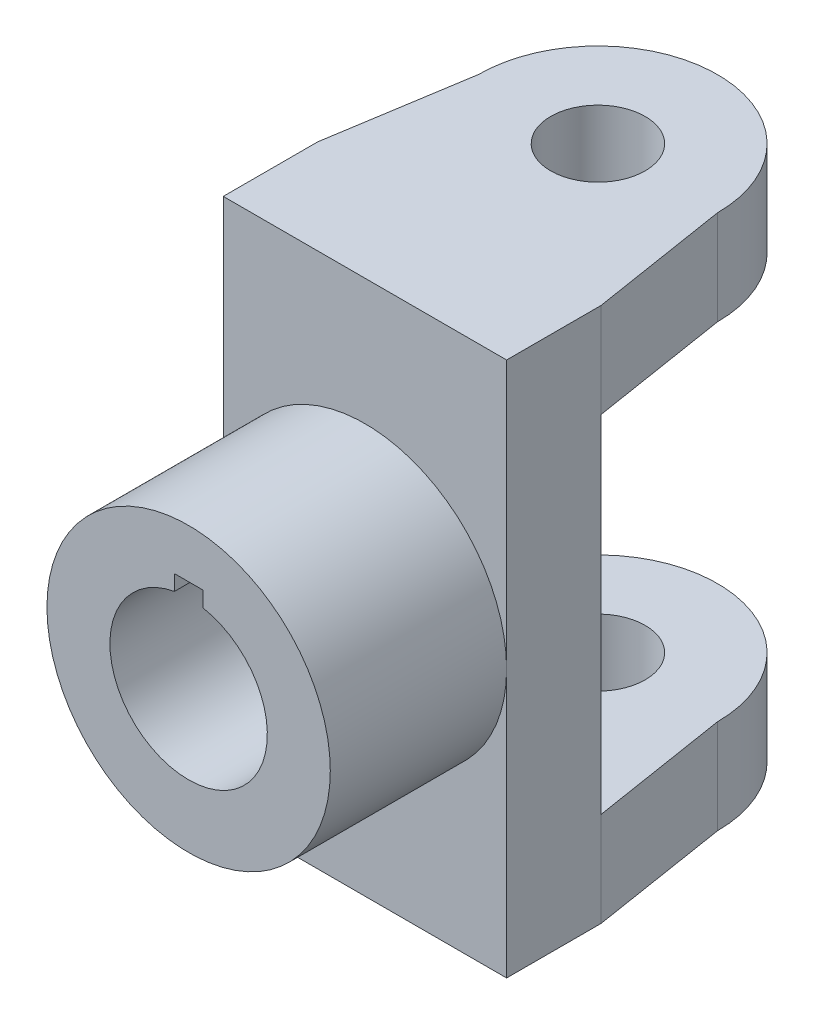
ISO-10303-21;
HEADER;
FILE_DESCRIPTION(('STEP AP214'),'2;1');
FILE_NAME('part.step','',(''),(''),'','','');
FILE_SCHEMA(('AUTOMOTIVE_DESIGN { 1 0 10303 214 1 1 1 1 }'));
ENDSEC;
DATA;
#1=APPLICATION_CONTEXT('core data for automotive mechanical design processes');
#2=APPLICATION_PROTOCOL_DEFINITION('international standard','automotive_design',2000,#1);
#3=PRODUCT_CONTEXT('',#1,'mechanical');
#4=PRODUCT('Part','Part','',(#3));
#5=PRODUCT_RELATED_PRODUCT_CATEGORY('part','',(#4));
#6=PRODUCT_DEFINITION_FORMATION('','',#4);
#7=PRODUCT_DEFINITION_CONTEXT('part definition',#1,'design');
#8=PRODUCT_DEFINITION('design','',#6,#7);
#9=PRODUCT_DEFINITION_SHAPE('','',#8);
#10=(LENGTH_UNIT() NAMED_UNIT(*) SI_UNIT(.MILLI.,.METRE.));
#11=(NAMED_UNIT(*) PLANE_ANGLE_UNIT() SI_UNIT($,.RADIAN.));
#12=(NAMED_UNIT(*) SI_UNIT($,.STERADIAN.) SOLID_ANGLE_UNIT());
#13=UNCERTAINTY_MEASURE_WITH_UNIT(LENGTH_MEASURE(1.E-05),#10,'distance_accuracy_value','');
#14=(GEOMETRIC_REPRESENTATION_CONTEXT(3) GLOBAL_UNCERTAINTY_ASSIGNED_CONTEXT((#13)) GLOBAL_UNIT_ASSIGNED_CONTEXT((#10,
#11,#12)) REPRESENTATION_CONTEXT('',''));
#15=CARTESIAN_POINT('',(0.,0.,0.));
#16=DIRECTION('',(0.,0.,1.));
#17=DIRECTION('',(1.,0.,0.));
#18=AXIS2_PLACEMENT_3D('',#15,#16,#17);
#19=CARTESIAN_POINT('',(57.233249370277,-85.,-9.10528967254403));
#20=DIRECTION('',(0.987580306335114,0.,-0.157115048735131));
#21=DIRECTION('',(-0.157115048735131,0.,-0.987580306335114));
#22=AXIS2_PLACEMENT_3D('',#19,#20,#21);
#23=PLANE('',#22);
#24=DIRECTION('',(0.157115048735131,0.,0.987580306335114));
#25=VECTOR('',#24,1.);
#26=CARTESIAN_POINT('',(57.233249370277,55.,-9.10528967254403));
#27=LINE('',#26,#25);
#28=CARTESIAN_POINT('',(38.,55.,-130.));
#29=VERTEX_POINT('',#28);
#30=CARTESIAN_POINT('',(44.9999999999999,55.,-86.));
#31=VERTEX_POINT('',#30);
#32=EDGE_CURVE('E278',#29,#31,#27,.T.);
#33=ORIENTED_EDGE('',*,*,#32,.F.);
#34=DIRECTION('',(0.,1.,0.));
#35=VECTOR('',#34,1.);
#36=CARTESIAN_POINT('',(38.,-85.,-130.));
#37=LINE('',#36,#35);
#38=CARTESIAN_POINT('',(38.,85.,-130.));
#39=VERTEX_POINT('',#38);
#40=EDGE_CURVE('E304',#29,#39,#37,.T.);
#41=ORIENTED_EDGE('',*,*,#40,.T.);
#42=DIRECTION('',(-0.157115048735131,0.,-0.987580306335114));
#43=VECTOR('',#42,1.);
#44=CARTESIAN_POINT('',(57.233249370277,85.,-9.10528967254403));
#45=LINE('',#44,#43);
#46=CARTESIAN_POINT('',(45.,85.,-86.));
#47=VERTEX_POINT('',#46);
#48=EDGE_CURVE('E281',#47,#39,#45,.T.);
#49=ORIENTED_EDGE('',*,*,#48,.F.);
#50=DIRECTION('',(0.,-1.,0.));
#51=VECTOR('',#50,1.);
#52=CARTESIAN_POINT('',(45.,85.,-86.));
#53=LINE('',#52,#51);
#54=EDGE_CURVE('E193',#47,#31,#53,.T.);
#55=ORIENTED_EDGE('',*,*,#54,.T.);
#56=EDGE_LOOP('',(#33,#41,#49,#55));
#57=FACE_BOUND('',#56,.T.);
#58=ADVANCED_FACE('F53',(#57),#23,.T.);
#59=CARTESIAN_POINT('',(-57.233249370277,-85.,-9.10528967254403));
#60=DIRECTION('',(0.987580306335114,0.,0.157115048735131));
#61=DIRECTION('',(0.157115048735131,0.,-0.987580306335114));
#62=AXIS2_PLACEMENT_3D('',#59,#60,#61);
#63=PLANE('',#62);
#64=DIRECTION('',(0.,1.,0.));
#65=VECTOR('',#64,1.);
#66=CARTESIAN_POINT('',(-38.,-85.,-130.));
#67=LINE('',#66,#65);
#68=CARTESIAN_POINT('',(-38.,55.,-130.));
#69=VERTEX_POINT('',#68);
#70=CARTESIAN_POINT('',(-38.,85.,-130.));
#71=VERTEX_POINT('',#70);
#72=EDGE_CURVE('E311',#69,#71,#67,.T.);
#73=ORIENTED_EDGE('',*,*,#72,.F.);
#74=DIRECTION('',(-0.157115048735131,0.,0.987580306335114));
#75=VECTOR('',#74,1.);
#76=CARTESIAN_POINT('',(-57.233249370277,55.,-9.10528967254403));
#77=LINE('',#76,#75);
#78=CARTESIAN_POINT('',(-45.,55.,-86.));
#79=VERTEX_POINT('',#78);
#80=EDGE_CURVE('E325',#69,#79,#77,.T.);
#81=ORIENTED_EDGE('',*,*,#80,.T.);
#82=DIRECTION('',(0.,1.,0.));
#83=VECTOR('',#82,1.);
#84=CARTESIAN_POINT('',(-45.,85.,-86.));
#85=LINE('',#84,#83);
#86=CARTESIAN_POINT('',(-45.,85.,-86.));
#87=VERTEX_POINT('',#86);
#88=EDGE_CURVE('E187',#79,#87,#85,.T.);
#89=ORIENTED_EDGE('',*,*,#88,.T.);
#90=DIRECTION('',(0.157115048735131,0.,-0.987580306335114));
#91=VECTOR('',#90,1.);
#92=CARTESIAN_POINT('',(-57.233249370277,85.,-9.10528967254403));
#93=LINE('',#92,#91);
#94=EDGE_CURVE('E298',#87,#71,#93,.T.);
#95=ORIENTED_EDGE('',*,*,#94,.T.);
#96=EDGE_LOOP('',(#73,#81,#89,#95));
#97=FACE_BOUND('',#96,.T.);
#98=ADVANCED_FACE('F324',(#97),#63,.F.);
#99=CARTESIAN_POINT('',(0.,-85.,-130.));
#100=DIRECTION('',(0.,1.,0.));
#101=DIRECTION('',(0.,0.,1.));
#102=AXIS2_PLACEMENT_3D('',#99,#100,#101);
#103=CYLINDRICAL_SURFACE('',#102,15.);
#104=CARTESIAN_POINT('',(0.,55.,-130.));
#105=DIRECTION('',(0.,1.,0.));
#106=DIRECTION('',(0.,0.,1.));
#107=AXIS2_PLACEMENT_3D('',#104,#105,#106);
#108=CIRCLE('',#107,15.);
#109=CARTESIAN_POINT('',(0.,55.,-115.));
#110=VERTEX_POINT('',#109);
#111=EDGE_CURVE('E286',#110,#110,#108,.F.);
#112=ORIENTED_EDGE('',*,*,#111,.T.);
#113=EDGE_LOOP('',(#112));
#114=FACE_BOUND('',#113,.T.);
#115=CARTESIAN_POINT('',(0.,85.,-130.));
#116=DIRECTION('',(0.,1.,0.));
#117=DIRECTION('',(0.,0.,1.));
#118=AXIS2_PLACEMENT_3D('',#115,#116,#117);
#119=CIRCLE('',#118,15.);
#120=CARTESIAN_POINT('',(0.,85.,-115.));
#121=VERTEX_POINT('',#120);
#122=EDGE_CURVE('E285',#121,#121,#119,.T.);
#123=ORIENTED_EDGE('',*,*,#122,.T.);
#124=EDGE_LOOP('',(#123));
#125=FACE_BOUND('',#124,.T.);
#126=ADVANCED_FACE('F339',(#114,#125),#103,.F.);
#127=CARTESIAN_POINT('',(0.,-85.,-130.));
#128=DIRECTION('',(0.,1.,0.));
#129=DIRECTION('',(0.,0.,1.));
#130=AXIS2_PLACEMENT_3D('',#127,#128,#129);
#131=CYLINDRICAL_SURFACE('',#130,38.);
#132=CARTESIAN_POINT('',(0.,55.,-130.));
#133=DIRECTION('',(0.,1.,0.));
#134=DIRECTION('',(0.,0.,1.));
#135=AXIS2_PLACEMENT_3D('',#132,#133,#134);
#136=CIRCLE('',#135,38.);
#137=EDGE_CURVE('E12',#69,#29,#136,.F.);
#138=ORIENTED_EDGE('',*,*,#137,.F.);
#139=ORIENTED_EDGE('',*,*,#72,.T.);
#140=CARTESIAN_POINT('',(0.,85.,-130.));
#141=DIRECTION('',(0.,1.,0.));
#142=DIRECTION('',(0.,0.,1.));
#143=AXIS2_PLACEMENT_3D('',#140,#141,#142);
#144=CIRCLE('',#143,38.);
#145=EDGE_CURVE('E307',#39,#71,#144,.T.);
#146=ORIENTED_EDGE('',*,*,#145,.F.);
#147=ORIENTED_EDGE('',*,*,#40,.F.);
#148=EDGE_LOOP('',(#138,#139,#146,#147));
#149=FACE_BOUND('',#148,.T.);
#150=ADVANCED_FACE('F318',(#149),#131,.T.);
#151=CARTESIAN_POINT('',(0.,0.,0.));
#152=DIRECTION('',(0.,0.,1.));
#153=DIRECTION('',(1.,0.,0.));
#154=AXIS2_PLACEMENT_3D('',#151,#152,#153);
#155=PLANE('',#154);
#156=CARTESIAN_POINT('',(0.,0.,0.));
#157=DIRECTION('',(0.,0.,1.));
#158=DIRECTION('',(1.,0.,0.));
#159=AXIS2_PLACEMENT_3D('',#156,#157,#158);
#160=CIRCLE('',#159,45.);
#161=CARTESIAN_POINT('',(45.,0.,0.));
#162=VERTEX_POINT('',#161);
#163=EDGE_CURVE('E249',#162,#162,#160,.T.);
#164=ORIENTED_EDGE('',*,*,#163,.T.);
#165=EDGE_LOOP('',(#164));
#166=FACE_BOUND('',#165,.T.);
#167=DIRECTION('',(0.,-1.,0.));
#168=VECTOR('',#167,1.);
#169=CARTESIAN_POINT('',(-4.5,29.4916652547159,0.));
#170=LINE('',#169,#168);
#171=CARTESIAN_POINT('',(-4.5,29.4916652547159,0.));
#172=VERTEX_POINT('',#171);
#173=CARTESIAN_POINT('',(-4.5,24.5916652547159,0.));
#174=VERTEX_POINT('',#173);
#175=EDGE_CURVE('E222',#172,#174,#170,.T.);
#176=ORIENTED_EDGE('',*,*,#175,.F.);
#177=DIRECTION('',(1.,0.,0.));
#178=VECTOR('',#177,1.);
#179=CARTESIAN_POINT('',(-4.5,29.4916652547159,0.));
#180=LINE('',#179,#178);
#181=CARTESIAN_POINT('',(4.5,29.4916652547159,0.));
#182=VERTEX_POINT('',#181);
#183=EDGE_CURVE('E217',#172,#182,#180,.T.);
#184=ORIENTED_EDGE('',*,*,#183,.T.);
#185=DIRECTION('',(0.,-1.,0.));
#186=VECTOR('',#185,1.);
#187=CARTESIAN_POINT('',(4.5,29.4916652547159,0.));
#188=LINE('',#187,#186);
#189=CARTESIAN_POINT('',(4.5,24.5916652547159,0.));
#190=VERTEX_POINT('',#189);
#191=EDGE_CURVE('E232',#182,#190,#188,.T.);
#192=ORIENTED_EDGE('',*,*,#191,.T.);
#193=CARTESIAN_POINT('',(0.,0.,0.));
#194=DIRECTION('',(0.,0.,1.));
#195=DIRECTION('',(1.,0.,0.));
#196=AXIS2_PLACEMENT_3D('',#193,#194,#195);
#197=CIRCLE('',#196,25.);
#198=EDGE_CURVE('E235',#174,#190,#197,.T.);
#199=ORIENTED_EDGE('',*,*,#198,.F.);
#200=EDGE_LOOP('',(#176,#184,#192,#199));
#201=FACE_BOUND('',#200,.T.);
#202=ADVANCED_FACE('F381',(#166,#201),#155,.T.);
#203=CARTESIAN_POINT('',(0.,0.,-56.));
#204=DIRECTION('',(0.,0.,1.));
#205=DIRECTION('',(1.,0.,0.));
#206=AXIS2_PLACEMENT_3D('',#203,#204,#205);
#207=CYLINDRICAL_SURFACE('',#206,45.);
#208=CARTESIAN_POINT('',(0.,0.,-56.));
#209=DIRECTION('',(0.,0.,1.));
#210=DIRECTION('',(1.,0.,0.));
#211=AXIS2_PLACEMENT_3D('',#208,#209,#210);
#212=CIRCLE('',#211,45.);
#213=CARTESIAN_POINT('',(45.,0.,-56.));
#214=VERTEX_POINT('',#213);
#215=CARTESIAN_POINT('',(-45.,0.,-56.));
#216=VERTEX_POINT('',#215);
#217=EDGE_CURVE('E250',#214,#216,#212,.T.);
#218=ORIENTED_EDGE('',*,*,#217,.T.);
#219=EDGE_CURVE('E253',#216,#214,#212,.T.);
#220=ORIENTED_EDGE('',*,*,#219,.T.);
#221=EDGE_LOOP('',(#218,#220));
#222=FACE_BOUND('',#221,.T.);
#223=ORIENTED_EDGE('',*,*,#163,.F.);
#224=EDGE_LOOP('',(#223));
#225=FACE_BOUND('',#224,.T.);
#226=ADVANCED_FACE('F55',(#222,#225),#207,.T.);
#227=CARTESIAN_POINT('',(-4.5,29.4916652547159,-56.));
#228=DIRECTION('',(0.,-1.,0.));
#229=DIRECTION('',(0.,0.,-1.));
#230=AXIS2_PLACEMENT_3D('',#227,#228,#229);
#231=PLANE('',#230);
#232=ORIENTED_EDGE('',*,*,#183,.F.);
#233=DIRECTION('',(0.,0.,1.));
#234=VECTOR('',#233,1.);
#235=CARTESIAN_POINT('',(-4.5,29.4916652547159,-56.));
#236=LINE('',#235,#234);
#237=CARTESIAN_POINT('',(-4.5,29.4916652547159,-56.));
#238=VERTEX_POINT('',#237);
#239=EDGE_CURVE('E229',#238,#172,#236,.T.);
#240=ORIENTED_EDGE('',*,*,#239,.F.);
#241=DIRECTION('',(1.,0.,0.));
#242=VECTOR('',#241,1.);
#243=CARTESIAN_POINT('',(-4.5,29.4916652547159,-56.));
#244=LINE('',#243,#242);
#245=CARTESIAN_POINT('',(4.5,29.4916652547159,-56.));
#246=VERTEX_POINT('',#245);
#247=EDGE_CURVE('E218',#238,#246,#244,.T.);
#248=ORIENTED_EDGE('',*,*,#247,.T.);
#249=DIRECTION('',(0.,0.,1.));
#250=VECTOR('',#249,1.);
#251=CARTESIAN_POINT('',(4.5,29.4916652547159,-56.));
#252=LINE('',#251,#250);
#253=EDGE_CURVE('E246',#246,#182,#252,.T.);
#254=ORIENTED_EDGE('',*,*,#253,.T.);
#255=EDGE_LOOP('',(#232,#240,#248,#254));
#256=FACE_BOUND('',#255,.T.);
#257=ADVANCED_FACE('F388',(#256),#231,.T.);
#258=CARTESIAN_POINT('',(4.5,29.4916652547159,-56.));
#259=DIRECTION('',(-1.,0.,0.));
#260=DIRECTION('',(0.,-1.,0.));
#261=AXIS2_PLACEMENT_3D('',#258,#259,#260);
#262=PLANE('',#261);
#263=ORIENTED_EDGE('',*,*,#191,.F.);
#264=ORIENTED_EDGE('',*,*,#253,.F.);
#265=DIRECTION('',(0.,-1.,0.));
#266=VECTOR('',#265,1.);
#267=CARTESIAN_POINT('',(4.5,29.4916652547159,-56.));
#268=LINE('',#267,#266);
#269=CARTESIAN_POINT('',(4.5,24.5916652547159,-56.));
#270=VERTEX_POINT('',#269);
#271=EDGE_CURVE('E221',#246,#270,#268,.T.);
#272=ORIENTED_EDGE('',*,*,#271,.T.);
#273=DIRECTION('',(0.,0.,1.));
#274=VECTOR('',#273,1.);
#275=CARTESIAN_POINT('',(4.5,24.5916652547159,-56.));
#276=LINE('',#275,#274);
#277=EDGE_CURVE('E244',#270,#190,#276,.T.);
#278=ORIENTED_EDGE('',*,*,#277,.T.);
#279=EDGE_LOOP('',(#263,#264,#272,#278));
#280=FACE_BOUND('',#279,.T.);
#281=ADVANCED_FACE('F393',(#280),#262,.T.);
#282=CARTESIAN_POINT('',(0.,0.,-56.));
#283=DIRECTION('',(0.,0.,1.));
#284=DIRECTION('',(1.,0.,0.));
#285=AXIS2_PLACEMENT_3D('',#282,#283,#284);
#286=CYLINDRICAL_SURFACE('',#285,25.);
#287=ORIENTED_EDGE('',*,*,#198,.T.);
#288=ORIENTED_EDGE('',*,*,#277,.F.);
#289=CARTESIAN_POINT('',(0.,0.,-56.));
#290=DIRECTION('',(0.,0.,1.));
#291=DIRECTION('',(1.,0.,0.));
#292=AXIS2_PLACEMENT_3D('',#289,#290,#291);
#293=CIRCLE('',#292,25.);
#294=CARTESIAN_POINT('',(-4.5,24.5916652547159,-56.));
#295=VERTEX_POINT('',#294);
#296=EDGE_CURVE('E225',#295,#270,#293,.T.);
#297=ORIENTED_EDGE('',*,*,#296,.F.);
#298=DIRECTION('',(0.,0.,1.));
#299=VECTOR('',#298,1.);
#300=CARTESIAN_POINT('',(-4.5,24.5916652547159,-56.));
#301=LINE('',#300,#299);
#302=EDGE_CURVE('E242',#295,#174,#301,.T.);
#303=ORIENTED_EDGE('',*,*,#302,.T.);
#304=EDGE_LOOP('',(#287,#288,#297,#303));
#305=FACE_BOUND('',#304,.T.);
#306=ADVANCED_FACE('F397',(#305),#286,.F.);
#307=CARTESIAN_POINT('',(-4.5,29.4916652547159,-56.));
#308=DIRECTION('',(-1.,0.,0.));
#309=DIRECTION('',(0.,-1.,0.));
#310=AXIS2_PLACEMENT_3D('',#307,#308,#309);
#311=PLANE('',#310);
#312=ORIENTED_EDGE('',*,*,#175,.T.);
#313=ORIENTED_EDGE('',*,*,#302,.F.);
#314=DIRECTION('',(0.,-1.,0.));
#315=VECTOR('',#314,1.);
#316=CARTESIAN_POINT('',(-4.5,29.4916652547159,-56.));
#317=LINE('',#316,#315);
#318=EDGE_CURVE('E227',#238,#295,#317,.T.);
#319=ORIENTED_EDGE('',*,*,#318,.F.);
#320=ORIENTED_EDGE('',*,*,#239,.T.);
#321=EDGE_LOOP('',(#312,#313,#319,#320));
#322=FACE_BOUND('',#321,.T.);
#323=ADVANCED_FACE('F401',(#322),#311,.F.);
#324=CARTESIAN_POINT('',(0.,0.,-56.));
#325=DIRECTION('',(0.,0.,-1.));
#326=DIRECTION('',(-1.,0.,0.));
#327=AXIS2_PLACEMENT_3D('',#324,#325,#326);
#328=PLANE('',#327);
#329=ORIENTED_EDGE('',*,*,#247,.F.);
#330=ORIENTED_EDGE('',*,*,#318,.T.);
#331=ORIENTED_EDGE('',*,*,#296,.T.);
#332=ORIENTED_EDGE('',*,*,#271,.F.);
#333=EDGE_LOOP('',(#329,#330,#331,#332));
#334=FACE_BOUND('',#333,.T.);
#335=ADVANCED_FACE('F404',(#334),#328,.F.);
#336=ORIENTED_EDGE('',*,*,#217,.F.);
#337=DIRECTION('',(0.,-1.,0.));
#338=VECTOR('',#337,1.);
#339=CARTESIAN_POINT('',(45.,85.,-56.));
#340=LINE('',#339,#338);
#341=CARTESIAN_POINT('',(45.,85.,-56.));
#342=VERTEX_POINT('',#341);
#343=EDGE_CURVE('E76',#342,#214,#340,.T.);
#344=ORIENTED_EDGE('',*,*,#343,.F.);
#345=DIRECTION('',(1.,0.,0.));
#346=VECTOR('',#345,1.);
#347=CARTESIAN_POINT('',(45.,85.,-56.));
#348=LINE('',#347,#346);
#349=CARTESIAN_POINT('',(-45.,85.,-56.));
#350=VERTEX_POINT('',#349);
#351=EDGE_CURVE('E270',#350,#342,#348,.T.);
#352=ORIENTED_EDGE('',*,*,#351,.F.);
#353=DIRECTION('',(0.,1.,0.));
#354=VECTOR('',#353,1.);
#355=CARTESIAN_POINT('',(-45.,85.,-56.));
#356=LINE('',#355,#354);
#357=EDGE_CURVE('E268',#216,#350,#356,.T.);
#358=ORIENTED_EDGE('',*,*,#357,.F.);
#359=EDGE_LOOP('',(#336,#344,#352,#358));
#360=FACE_BOUND('',#359,.T.);
#361=ADVANCED_FACE('F269',(#360),#328,.F.);
#362=ORIENTED_EDGE('',*,*,#219,.F.);
#363=CARTESIAN_POINT('',(-45.,-85.,-56.));
#364=VERTEX_POINT('',#363);
#365=EDGE_CURVE('E265',#364,#216,#356,.T.);
#366=ORIENTED_EDGE('',*,*,#365,.F.);
#367=DIRECTION('',(-1.,0.,0.));
#368=VECTOR('',#367,1.);
#369=CARTESIAN_POINT('',(45.,-85.,-56.));
#370=LINE('',#369,#368);
#371=CARTESIAN_POINT('',(45.,-85.,-56.));
#372=VERTEX_POINT('',#371);
#373=EDGE_CURVE('E196',#372,#364,#370,.T.);
#374=ORIENTED_EDGE('',*,*,#373,.F.);
#375=EDGE_CURVE('E204',#214,#372,#340,.T.);
#376=ORIENTED_EDGE('',*,*,#375,.F.);
#377=EDGE_LOOP('',(#362,#366,#374,#376));
#378=FACE_BOUND('',#377,.T.);
#379=ADVANCED_FACE('F264',(#378),#328,.F.);
#380=CARTESIAN_POINT('',(-45.,85.,-86.));
#381=DIRECTION('',(1.,0.,0.));
#382=DIRECTION('',(0.,1.,0.));
#383=AXIS2_PLACEMENT_3D('',#380,#381,#382);
#384=PLANE('',#383);
#385=ORIENTED_EDGE('',*,*,#365,.T.);
#386=ORIENTED_EDGE('',*,*,#357,.T.);
#387=DIRECTION('',(0.,0.,1.));
#388=VECTOR('',#387,1.);
#389=CARTESIAN_POINT('',(-45.,85.,-86.));
#390=LINE('',#389,#388);
#391=EDGE_CURVE('E214',#87,#350,#390,.T.);
#392=ORIENTED_EDGE('',*,*,#391,.F.);
#393=ORIENTED_EDGE('',*,*,#88,.F.);
#394=CARTESIAN_POINT('',(-45.,-55.,-86.));
#395=VERTEX_POINT('',#394);
#396=EDGE_CURVE('E174',#395,#79,#85,.T.);
#397=ORIENTED_EDGE('',*,*,#396,.F.);
#398=CARTESIAN_POINT('',(-45.,-85.,-86.));
#399=VERTEX_POINT('',#398);
#400=EDGE_CURVE('E184',#399,#395,#85,.T.);
#401=ORIENTED_EDGE('',*,*,#400,.F.);
#402=DIRECTION('',(0.,0.,1.));
#403=VECTOR('',#402,1.);
#404=CARTESIAN_POINT('',(-45.,-85.,-86.));
#405=LINE('',#404,#403);
#406=EDGE_CURVE('E208',#399,#364,#405,.T.);
#407=ORIENTED_EDGE('',*,*,#406,.T.);
#408=EDGE_LOOP('',(#385,#386,#392,#393,#397,#401,#407));
#409=FACE_BOUND('',#408,.T.);
#410=ADVANCED_FACE('F182',(#409),#384,.F.);
#411=CARTESIAN_POINT('',(45.,85.,-86.));
#412=DIRECTION('',(0.,-1.,0.));
#413=DIRECTION('',(0.,0.,-1.));
#414=AXIS2_PLACEMENT_3D('',#411,#412,#413);
#415=PLANE('',#414);
#416=ORIENTED_EDGE('',*,*,#351,.T.);
#417=DIRECTION('',(0.,0.,1.));
#418=VECTOR('',#417,1.);
#419=CARTESIAN_POINT('',(45.,85.,-86.));
#420=LINE('',#419,#418);
#421=EDGE_CURVE('E212',#47,#342,#420,.T.);
#422=ORIENTED_EDGE('',*,*,#421,.F.);
#423=ORIENTED_EDGE('',*,*,#48,.T.);
#424=ORIENTED_EDGE('',*,*,#145,.T.);
#425=ORIENTED_EDGE('',*,*,#94,.F.);
#426=ORIENTED_EDGE('',*,*,#391,.T.);
#427=EDGE_LOOP('',(#416,#422,#423,#424,#425,#426));
#428=FACE_BOUND('',#427,.T.);
#429=ORIENTED_EDGE('',*,*,#122,.F.);
#430=EDGE_LOOP('',(#429));
#431=FACE_BOUND('',#430,.T.);
#432=ADVANCED_FACE('F322',(#428,#431),#415,.F.);
#433=CARTESIAN_POINT('',(45.,85.,-86.));
#434=DIRECTION('',(-1.,0.,0.));
#435=DIRECTION('',(0.,-1.,0.));
#436=AXIS2_PLACEMENT_3D('',#433,#434,#435);
#437=PLANE('',#436);
#438=ORIENTED_EDGE('',*,*,#343,.T.);
#439=ORIENTED_EDGE('',*,*,#375,.T.);
#440=DIRECTION('',(0.,0.,1.));
#441=VECTOR('',#440,1.);
#442=CARTESIAN_POINT('',(45.,-85.,-86.));
#443=LINE('',#442,#441);
#444=CARTESIAN_POINT('',(45.,-85.,-86.));
#445=VERTEX_POINT('',#444);
#446=EDGE_CURVE('E210',#445,#372,#443,.T.);
#447=ORIENTED_EDGE('',*,*,#446,.F.);
#448=CARTESIAN_POINT('',(44.9999999999999,-55.,-86.));
#449=VERTEX_POINT('',#448);
#450=EDGE_CURVE('E192',#449,#445,#53,.T.);
#451=ORIENTED_EDGE('',*,*,#450,.F.);
#452=DIRECTION('',(0.,-1.,0.));
#453=VECTOR('',#452,1.);
#454=CARTESIAN_POINT('',(45.,-85.,-86.));
#455=LINE('',#454,#453);
#456=EDGE_CURVE('E177',#31,#449,#455,.T.);
#457=ORIENTED_EDGE('',*,*,#456,.F.);
#458=ORIENTED_EDGE('',*,*,#54,.F.);
#459=ORIENTED_EDGE('',*,*,#421,.T.);
#460=EDGE_LOOP('',(#438,#439,#447,#451,#457,#458,#459));
#461=FACE_BOUND('',#460,.T.);
#462=ADVANCED_FACE('F282',(#461),#437,.F.);
#463=CARTESIAN_POINT('',(45.,-85.,-86.));
#464=DIRECTION('',(0.,1.,0.));
#465=DIRECTION('',(0.,0.,1.));
#466=AXIS2_PLACEMENT_3D('',#463,#464,#465);
#467=PLANE('',#466);
#468=ORIENTED_EDGE('',*,*,#373,.T.);
#469=ORIENTED_EDGE('',*,*,#406,.F.);
#470=DIRECTION('',(0.157115048735131,0.,-0.987580306335114));
#471=VECTOR('',#470,1.);
#472=CARTESIAN_POINT('',(-57.233249370277,-85.,-9.10528967254403));
#473=LINE('',#472,#471);
#474=CARTESIAN_POINT('',(-38.,-85.,-130.));
#475=VERTEX_POINT('',#474);
#476=EDGE_CURVE('E191',#399,#475,#473,.T.);
#477=ORIENTED_EDGE('',*,*,#476,.T.);
#478=CARTESIAN_POINT('',(0.,-85.,-130.));
#479=DIRECTION('',(0.,1.,0.));
#480=DIRECTION('',(0.,0.,1.));
#481=AXIS2_PLACEMENT_3D('',#478,#479,#480);
#482=CIRCLE('',#481,38.);
#483=CARTESIAN_POINT('',(38.,-85.,-130.));
#484=VERTEX_POINT('',#483);
#485=EDGE_CURVE('E301',#484,#475,#482,.T.);
#486=ORIENTED_EDGE('',*,*,#485,.F.);
#487=DIRECTION('',(-0.157115048735131,0.,-0.987580306335114));
#488=VECTOR('',#487,1.);
#489=CARTESIAN_POINT('',(57.233249370277,-85.,-9.10528967254403));
#490=LINE('',#489,#488);
#491=EDGE_CURVE('E297',#445,#484,#490,.T.);
#492=ORIENTED_EDGE('',*,*,#491,.F.);
#493=ORIENTED_EDGE('',*,*,#446,.T.);
#494=EDGE_LOOP('',(#468,#469,#477,#486,#492,#493));
#495=FACE_BOUND('',#494,.T.);
#496=CARTESIAN_POINT('',(0.,-85.,-130.));
#497=DIRECTION('',(0.,1.,0.));
#498=DIRECTION('',(0.,0.,1.));
#499=AXIS2_PLACEMENT_3D('',#496,#497,#498);
#500=CIRCLE('',#499,15.);
#501=CARTESIAN_POINT('',(0.,-85.,-115.));
#502=VERTEX_POINT('',#501);
#503=EDGE_CURVE('E294',#502,#502,#500,.T.);
#504=ORIENTED_EDGE('',*,*,#503,.T.);
#505=EDGE_LOOP('',(#504));
#506=FACE_BOUND('',#505,.T.);
#507=ADVANCED_FACE('F351',(#495,#506),#467,.F.);
#508=DIRECTION('',(-0.157115048735131,0.,-0.987580306335114));
#509=VECTOR('',#508,1.);
#510=CARTESIAN_POINT('',(57.233249370277,-55.,-9.10528967254403));
#511=LINE('',#510,#509);
#512=CARTESIAN_POINT('',(38.,-55.,-130.));
#513=VERTEX_POINT('',#512);
#514=EDGE_CURVE('E68',#449,#513,#511,.T.);
#515=ORIENTED_EDGE('',*,*,#514,.F.);
#516=ORIENTED_EDGE('',*,*,#450,.T.);
#517=ORIENTED_EDGE('',*,*,#491,.T.);
#518=EDGE_CURVE('E312',#484,#513,#37,.T.);
#519=ORIENTED_EDGE('',*,*,#518,.T.);
#520=EDGE_LOOP('',(#515,#516,#517,#519));
#521=FACE_BOUND('',#520,.T.);
#522=ADVANCED_FACE('F356',(#521),#23,.T.);
#523=ORIENTED_EDGE('',*,*,#400,.T.);
#524=DIRECTION('',(0.157115048735131,0.,-0.987580306335114));
#525=VECTOR('',#524,1.);
#526=CARTESIAN_POINT('',(-57.233249370277,-55.,-9.10528967254403));
#527=LINE('',#526,#525);
#528=CARTESIAN_POINT('',(-38.,-55.,-130.));
#529=VERTEX_POINT('',#528);
#530=EDGE_CURVE('E159',#395,#529,#527,.T.);
#531=ORIENTED_EDGE('',*,*,#530,.T.);
#532=EDGE_CURVE('E271',#475,#529,#67,.T.);
#533=ORIENTED_EDGE('',*,*,#532,.F.);
#534=ORIENTED_EDGE('',*,*,#476,.F.);
#535=EDGE_LOOP('',(#523,#531,#533,#534));
#536=FACE_BOUND('',#535,.T.);
#537=ADVANCED_FACE('F190',(#536),#63,.F.);
#538=CARTESIAN_POINT('',(0.,-55.,-130.));
#539=DIRECTION('',(0.,-1.,0.));
#540=DIRECTION('',(0.,0.,-1.));
#541=AXIS2_PLACEMENT_3D('',#538,#539,#540);
#542=CIRCLE('',#541,15.);
#543=CARTESIAN_POINT('',(0.,-55.,-145.));
#544=VERTEX_POINT('',#543);
#545=EDGE_CURVE('E327',#544,#544,#542,.F.);
#546=ORIENTED_EDGE('',*,*,#545,.T.);
#547=EDGE_LOOP('',(#546));
#548=FACE_BOUND('',#547,.T.);
#549=ORIENTED_EDGE('',*,*,#503,.F.);
#550=EDGE_LOOP('',(#549));
#551=FACE_BOUND('',#550,.T.);
#552=ADVANCED_FACE('F343',(#548,#551),#103,.F.);
#553=CARTESIAN_POINT('',(0.,-55.,-130.));
#554=DIRECTION('',(0.,-1.,0.));
#555=DIRECTION('',(0.,0.,-1.));
#556=AXIS2_PLACEMENT_3D('',#553,#554,#555);
#557=CIRCLE('',#556,38.);
#558=EDGE_CURVE('E61',#513,#529,#557,.F.);
#559=ORIENTED_EDGE('',*,*,#558,.F.);
#560=ORIENTED_EDGE('',*,*,#518,.F.);
#561=ORIENTED_EDGE('',*,*,#485,.T.);
#562=ORIENTED_EDGE('',*,*,#532,.T.);
#563=EDGE_LOOP('',(#559,#560,#561,#562));
#564=FACE_BOUND('',#563,.T.);
#565=ADVANCED_FACE('F372',(#564),#131,.T.);
#566=CARTESIAN_POINT('',(-130.,-55.,-86.));
#567=DIRECTION('',(0.,0.,1.));
#568=DIRECTION('',(1.,0.,0.));
#569=AXIS2_PLACEMENT_3D('',#566,#567,#568);
#570=PLANE('',#569);
#571=ORIENTED_EDGE('',*,*,#456,.T.);
#572=DIRECTION('',(1.,0.,0.));
#573=VECTOR('',#572,1.);
#574=CARTESIAN_POINT('',(-130.,-55.,-86.));
#575=LINE('',#574,#573);
#576=EDGE_CURVE('E163',#395,#449,#575,.T.);
#577=ORIENTED_EDGE('',*,*,#576,.F.);
#578=ORIENTED_EDGE('',*,*,#396,.T.);
#579=DIRECTION('',(1.,0.,0.));
#580=VECTOR('',#579,1.);
#581=CARTESIAN_POINT('',(-130.,55.,-86.));
#582=LINE('',#581,#580);
#583=EDGE_CURVE('E168',#79,#31,#582,.T.);
#584=ORIENTED_EDGE('',*,*,#583,.T.);
#585=EDGE_LOOP('',(#571,#577,#578,#584));
#586=FACE_BOUND('',#585,.T.);
#587=ADVANCED_FACE('F172',(#586),#570,.F.);
#588=CARTESIAN_POINT('',(-130.,55.,-86.));
#589=DIRECTION('',(0.,1.,0.));
#590=DIRECTION('',(0.,0.,1.));
#591=AXIS2_PLACEMENT_3D('',#588,#589,#590);
#592=PLANE('',#591);
#593=ORIENTED_EDGE('',*,*,#32,.T.);
#594=ORIENTED_EDGE('',*,*,#583,.F.);
#595=ORIENTED_EDGE('',*,*,#80,.F.);
#596=ORIENTED_EDGE('',*,*,#137,.T.);
#597=EDGE_LOOP('',(#593,#594,#595,#596));
#598=FACE_BOUND('',#597,.T.);
#599=ORIENTED_EDGE('',*,*,#111,.F.);
#600=EDGE_LOOP('',(#599));
#601=FACE_BOUND('',#600,.T.);
#602=ADVANCED_FACE('F333',(#598,#601),#592,.F.);
#603=CARTESIAN_POINT('',(-130.,-55.,-86.));
#604=DIRECTION('',(0.,-1.,0.));
#605=DIRECTION('',(0.,0.,-1.));
#606=AXIS2_PLACEMENT_3D('',#603,#604,#605);
#607=PLANE('',#606);
#608=ORIENTED_EDGE('',*,*,#514,.T.);
#609=ORIENTED_EDGE('',*,*,#558,.T.);
#610=ORIENTED_EDGE('',*,*,#530,.F.);
#611=ORIENTED_EDGE('',*,*,#576,.T.);
#612=EDGE_LOOP('',(#608,#609,#610,#611));
#613=FACE_BOUND('',#612,.T.);
#614=ORIENTED_EDGE('',*,*,#545,.F.);
#615=EDGE_LOOP('',(#614));
#616=FACE_BOUND('',#615,.T.);
#617=ADVANCED_FACE('F161',(#613,#616),#607,.F.);
#618=CLOSED_SHELL('',(#58,#98,#126,#150,#202,#226,#257,#281,#306,#323,#335,#361,#379,#410,#432,
#462,#507,#522,#537,#552,#565,#587,#602,#617));
#619=MANIFOLD_SOLID_BREP('B2',#618);
#620=ADVANCED_BREP_SHAPE_REPRESENTATION('',(#18,#619),#14);
#621=SHAPE_DEFINITION_REPRESENTATION(#9,#620);
ENDSEC;
END-ISO-10303-21;
